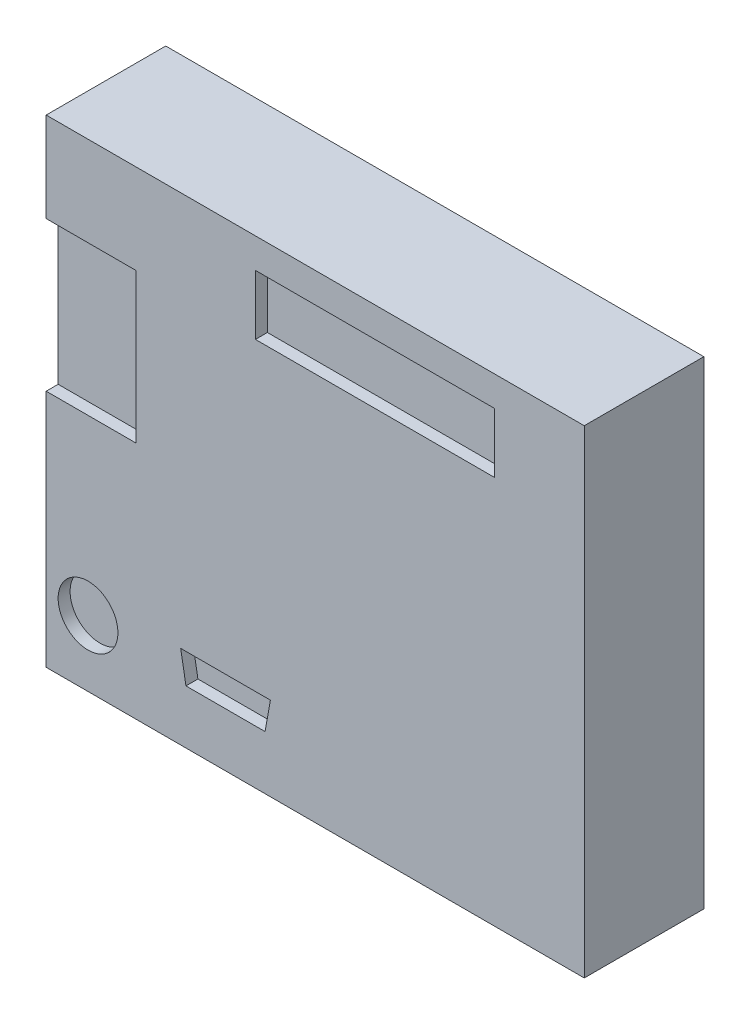
ISO-10303-21;
HEADER;
FILE_DESCRIPTION(('STEP AP214'),'2;1');
FILE_NAME('part.step','',(''),(''),'','','');
FILE_SCHEMA(('AUTOMOTIVE_DESIGN { 1 0 10303 214 1 1 1 1 }'));
ENDSEC;
DATA;
#1=APPLICATION_CONTEXT('core data for automotive mechanical design processes');
#2=APPLICATION_PROTOCOL_DEFINITION('international standard','automotive_design',2000,#1);
#3=PRODUCT_CONTEXT('',#1,'mechanical');
#4=PRODUCT('Part','Part','',(#3));
#5=PRODUCT_RELATED_PRODUCT_CATEGORY('part','',(#4));
#6=PRODUCT_DEFINITION_FORMATION('','',#4);
#7=PRODUCT_DEFINITION_CONTEXT('part definition',#1,'design');
#8=PRODUCT_DEFINITION('design','',#6,#7);
#9=PRODUCT_DEFINITION_SHAPE('','',#8);
#10=(LENGTH_UNIT() NAMED_UNIT(*) SI_UNIT(.MILLI.,.METRE.));
#11=(NAMED_UNIT(*) PLANE_ANGLE_UNIT() SI_UNIT($,.RADIAN.));
#12=(NAMED_UNIT(*) SI_UNIT($,.STERADIAN.) SOLID_ANGLE_UNIT());
#13=UNCERTAINTY_MEASURE_WITH_UNIT(LENGTH_MEASURE(1.E-05),#10,'distance_accuracy_value','');
#14=(GEOMETRIC_REPRESENTATION_CONTEXT(3) GLOBAL_UNCERTAINTY_ASSIGNED_CONTEXT((#13)) GLOBAL_UNIT_ASSIGNED_CONTEXT((#10,
#11,#12)) REPRESENTATION_CONTEXT('',''));
#15=CARTESIAN_POINT('',(0.,0.,0.));
#16=DIRECTION('',(0.,0.,1.));
#17=DIRECTION('',(1.,0.,0.));
#18=AXIS2_PLACEMENT_3D('',#15,#16,#17);
#19=CARTESIAN_POINT('',(45.,40.,20.));
#20=DIRECTION('',(-1.,0.,0.));
#21=DIRECTION('',(0.,-1.,0.));
#22=AXIS2_PLACEMENT_3D('',#19,#20,#21);
#23=PLANE('',#22);
#24=DIRECTION('',(0.,1.,0.));
#25=VECTOR('',#24,1.);
#26=CARTESIAN_POINT('',(45.,40.,0.));
#27=LINE('',#26,#25);
#28=CARTESIAN_POINT('',(45.,-40.,0.));
#29=VERTEX_POINT('',#28);
#30=CARTESIAN_POINT('',(45.,40.,0.));
#31=VERTEX_POINT('',#30);
#32=EDGE_CURVE('E271',#29,#31,#27,.T.);
#33=ORIENTED_EDGE('',*,*,#32,.T.);
#34=DIRECTION('',(0.,0.,-1.));
#35=VECTOR('',#34,1.);
#36=CARTESIAN_POINT('',(45.,40.,20.));
#37=LINE('',#36,#35);
#38=CARTESIAN_POINT('',(45.,40.,20.));
#39=VERTEX_POINT('',#38);
#40=EDGE_CURVE('E11',#39,#31,#37,.T.);
#41=ORIENTED_EDGE('',*,*,#40,.F.);
#42=DIRECTION('',(0.,1.,0.));
#43=VECTOR('',#42,1.);
#44=CARTESIAN_POINT('',(45.,40.,20.));
#45=LINE('',#44,#43);
#46=CARTESIAN_POINT('',(45.,-40.,20.));
#47=VERTEX_POINT('',#46);
#48=EDGE_CURVE('E281',#47,#39,#45,.T.);
#49=ORIENTED_EDGE('',*,*,#48,.F.);
#50=DIRECTION('',(0.,0.,-1.));
#51=VECTOR('',#50,1.);
#52=CARTESIAN_POINT('',(45.,-40.,20.));
#53=LINE('',#52,#51);
#54=EDGE_CURVE('E296',#47,#29,#53,.T.);
#55=ORIENTED_EDGE('',*,*,#54,.T.);
#56=EDGE_LOOP('',(#33,#41,#49,#55));
#57=FACE_BOUND('',#56,.T.);
#58=ADVANCED_FACE('F39',(#57),#23,.F.);
#59=CARTESIAN_POINT('',(-45.,40.,20.));
#60=DIRECTION('',(0.,-1.,0.));
#61=DIRECTION('',(0.,0.,-1.));
#62=AXIS2_PLACEMENT_3D('',#59,#60,#61);
#63=PLANE('',#62);
#64=DIRECTION('',(-1.,0.,0.));
#65=VECTOR('',#64,1.);
#66=CARTESIAN_POINT('',(-45.,40.,0.));
#67=LINE('',#66,#65);
#68=CARTESIAN_POINT('',(-45.,40.,0.));
#69=VERTEX_POINT('',#68);
#70=EDGE_CURVE('E300',#31,#69,#67,.T.);
#71=ORIENTED_EDGE('',*,*,#70,.T.);
#72=DIRECTION('',(0.,0.,-1.));
#73=VECTOR('',#72,1.);
#74=CARTESIAN_POINT('',(-45.,40.,20.));
#75=LINE('',#74,#73);
#76=CARTESIAN_POINT('',(-45.,40.,20.));
#77=VERTEX_POINT('',#76);
#78=EDGE_CURVE('E47',#77,#69,#75,.T.);
#79=ORIENTED_EDGE('',*,*,#78,.F.);
#80=DIRECTION('',(-1.,0.,0.));
#81=VECTOR('',#80,1.);
#82=CARTESIAN_POINT('',(-45.,40.,20.));
#83=LINE('',#82,#81);
#84=EDGE_CURVE('E285',#39,#77,#83,.T.);
#85=ORIENTED_EDGE('',*,*,#84,.F.);
#86=ORIENTED_EDGE('',*,*,#40,.T.);
#87=EDGE_LOOP('',(#71,#79,#85,#86));
#88=FACE_BOUND('',#87,.T.);
#89=ADVANCED_FACE('F365',(#88),#63,.F.);
#90=CARTESIAN_POINT('',(-45.,40.,20.));
#91=DIRECTION('',(1.,0.,0.));
#92=DIRECTION('',(0.,1.,0.));
#93=AXIS2_PLACEMENT_3D('',#90,#91,#92);
#94=PLANE('',#93);
#95=DIRECTION('',(0.,-1.,0.));
#96=VECTOR('',#95,1.);
#97=CARTESIAN_POINT('',(-45.,25.,18.));
#98=LINE('',#97,#96);
#99=CARTESIAN_POINT('',(-45.,25.,18.));
#100=VERTEX_POINT('',#99);
#101=CARTESIAN_POINT('',(-45.,0.,18.));
#102=VERTEX_POINT('',#101);
#103=EDGE_CURVE('E160',#100,#102,#98,.T.);
#104=ORIENTED_EDGE('',*,*,#103,.F.);
#105=DIRECTION('',(0.,0.,1.));
#106=VECTOR('',#105,1.);
#107=CARTESIAN_POINT('',(-45.,25.,18.));
#108=LINE('',#107,#106);
#109=CARTESIAN_POINT('',(-45.,25.,20.));
#110=VERTEX_POINT('',#109);
#111=EDGE_CURVE('E193',#100,#110,#108,.T.);
#112=ORIENTED_EDGE('',*,*,#111,.T.);
#113=DIRECTION('',(0.,-1.,0.));
#114=VECTOR('',#113,1.);
#115=CARTESIAN_POINT('',(-45.,40.,20.));
#116=LINE('',#115,#114);
#117=EDGE_CURVE('E289',#77,#110,#116,.T.);
#118=ORIENTED_EDGE('',*,*,#117,.F.);
#119=ORIENTED_EDGE('',*,*,#78,.T.);
#120=DIRECTION('',(0.,-1.,0.));
#121=VECTOR('',#120,1.);
#122=CARTESIAN_POINT('',(-45.,40.,0.));
#123=LINE('',#122,#121);
#124=CARTESIAN_POINT('',(-45.,-40.,0.));
#125=VERTEX_POINT('',#124);
#126=EDGE_CURVE('E303',#69,#125,#123,.T.);
#127=ORIENTED_EDGE('',*,*,#126,.T.);
#128=DIRECTION('',(0.,0.,-1.));
#129=VECTOR('',#128,1.);
#130=CARTESIAN_POINT('',(-45.,-40.,20.));
#131=LINE('',#130,#129);
#132=CARTESIAN_POINT('',(-45.,-40.,20.));
#133=VERTEX_POINT('',#132);
#134=EDGE_CURVE('E311',#133,#125,#131,.T.);
#135=ORIENTED_EDGE('',*,*,#134,.F.);
#136=CARTESIAN_POINT('',(-45.,0.,20.));
#137=VERTEX_POINT('',#136);
#138=EDGE_CURVE('E175',#137,#133,#116,.T.);
#139=ORIENTED_EDGE('',*,*,#138,.F.);
#140=DIRECTION('',(0.,0.,1.));
#141=VECTOR('',#140,1.);
#142=CARTESIAN_POINT('',(-45.,0.,18.));
#143=LINE('',#142,#141);
#144=EDGE_CURVE('E54',#102,#137,#143,.T.);
#145=ORIENTED_EDGE('',*,*,#144,.F.);
#146=EDGE_LOOP('',(#104,#112,#118,#119,#127,#135,#139,#145));
#147=FACE_BOUND('',#146,.T.);
#148=ADVANCED_FACE('F173',(#147),#94,.F.);
#149=CARTESIAN_POINT('',(-45.,-40.,20.));
#150=DIRECTION('',(0.,1.,0.));
#151=DIRECTION('',(0.,0.,1.));
#152=AXIS2_PLACEMENT_3D('',#149,#150,#151);
#153=PLANE('',#152);
#154=DIRECTION('',(1.,0.,0.));
#155=VECTOR('',#154,1.);
#156=CARTESIAN_POINT('',(-45.,-40.,0.));
#157=LINE('',#156,#155);
#158=EDGE_CURVE('E286',#125,#29,#157,.T.);
#159=ORIENTED_EDGE('',*,*,#158,.T.);
#160=ORIENTED_EDGE('',*,*,#54,.F.);
#161=DIRECTION('',(1.,0.,0.));
#162=VECTOR('',#161,1.);
#163=CARTESIAN_POINT('',(-45.,-40.,20.));
#164=LINE('',#163,#162);
#165=EDGE_CURVE('E293',#133,#47,#164,.T.);
#166=ORIENTED_EDGE('',*,*,#165,.F.);
#167=ORIENTED_EDGE('',*,*,#134,.T.);
#168=EDGE_LOOP('',(#159,#160,#166,#167));
#169=FACE_BOUND('',#168,.T.);
#170=ADVANCED_FACE('F326',(#169),#153,.F.);
#171=CARTESIAN_POINT('',(0.,0.,20.));
#172=DIRECTION('',(0.,0.,1.));
#173=DIRECTION('',(1.,0.,0.));
#174=AXIS2_PLACEMENT_3D('',#171,#172,#173);
#175=PLANE('',#174);
#176=DIRECTION('',(-1.,0.,0.));
#177=VECTOR('',#176,1.);
#178=CARTESIAN_POINT('',(-45.,25.,20.));
#179=LINE('',#178,#177);
#180=CARTESIAN_POINT('',(-30.,25.,20.));
#181=VERTEX_POINT('',#180);
#182=EDGE_CURVE('E170',#181,#110,#179,.T.);
#183=ORIENTED_EDGE('',*,*,#182,.F.);
#184=DIRECTION('',(0.,1.,0.));
#185=VECTOR('',#184,1.);
#186=CARTESIAN_POINT('',(-30.,25.,20.));
#187=LINE('',#186,#185);
#188=CARTESIAN_POINT('',(-30.,0.,20.));
#189=VERTEX_POINT('',#188);
#190=EDGE_CURVE('E346',#189,#181,#187,.T.);
#191=ORIENTED_EDGE('',*,*,#190,.F.);
#192=DIRECTION('',(1.,0.,0.));
#193=VECTOR('',#192,1.);
#194=CARTESIAN_POINT('',(-45.,0.,20.));
#195=LINE('',#194,#193);
#196=EDGE_CURVE('E336',#137,#189,#195,.T.);
#197=ORIENTED_EDGE('',*,*,#196,.F.);
#198=ORIENTED_EDGE('',*,*,#138,.T.);
#199=ORIENTED_EDGE('',*,*,#165,.T.);
#200=ORIENTED_EDGE('',*,*,#48,.T.);
#201=ORIENTED_EDGE('',*,*,#84,.T.);
#202=ORIENTED_EDGE('',*,*,#117,.T.);
#203=EDGE_LOOP('',(#183,#191,#197,#198,#199,#200,#201,#202));
#204=FACE_BOUND('',#203,.T.);
#205=CARTESIAN_POINT('',(-38.,-29.,20.));
#206=DIRECTION('',(0.,0.,1.));
#207=DIRECTION('',(1.,0.,0.));
#208=AXIS2_PLACEMENT_3D('',#205,#206,#207);
#209=CIRCLE('',#208,5.);
#210=CARTESIAN_POINT('',(-33.,-29.,20.));
#211=VERTEX_POINT('',#210);
#212=EDGE_CURVE('E189',#211,#211,#209,.T.);
#213=ORIENTED_EDGE('',*,*,#212,.F.);
#214=EDGE_LOOP('',(#213));
#215=FACE_BOUND('',#214,.T.);
#216=DIRECTION('',(0.173648177666934,0.984807753012207,0.));
#217=VECTOR('',#216,1.);
#218=CARTESIAN_POINT('',(-7.49999999999999,-26.,20.));
#219=LINE('',#218,#217);
#220=CARTESIAN_POINT('',(-8.38163490354234,-31.,20.));
#221=VERTEX_POINT('',#220);
#222=CARTESIAN_POINT('',(-7.49999999999999,-26.,20.));
#223=VERTEX_POINT('',#222);
#224=EDGE_CURVE('E62',#221,#223,#219,.T.);
#225=ORIENTED_EDGE('',*,*,#224,.F.);
#226=DIRECTION('',(1.,0.,0.));
#227=VECTOR('',#226,1.);
#228=CARTESIAN_POINT('',(-8.38163490354234,-31.,20.));
#229=LINE('',#228,#227);
#230=CARTESIAN_POINT('',(-21.6183650964576,-31.,20.));
#231=VERTEX_POINT('',#230);
#232=EDGE_CURVE('E199',#231,#221,#229,.T.);
#233=ORIENTED_EDGE('',*,*,#232,.F.);
#234=DIRECTION('',(0.173648177666935,-0.984807753012207,0.));
#235=VECTOR('',#234,1.);
#236=CARTESIAN_POINT('',(-21.6183650964576,-31.,20.));
#237=LINE('',#236,#235);
#238=CARTESIAN_POINT('',(-22.5,-26.,20.));
#239=VERTEX_POINT('',#238);
#240=EDGE_CURVE('E218',#239,#231,#237,.T.);
#241=ORIENTED_EDGE('',*,*,#240,.F.);
#242=DIRECTION('',(-1.,0.,0.));
#243=VECTOR('',#242,1.);
#244=CARTESIAN_POINT('',(-22.5,-26.,20.));
#245=LINE('',#244,#243);
#246=EDGE_CURVE('E214',#223,#239,#245,.T.);
#247=ORIENTED_EDGE('',*,*,#246,.F.);
#248=EDGE_LOOP('',(#225,#233,#241,#247));
#249=FACE_BOUND('',#248,.T.);
#250=DIRECTION('',(0.,-1.,0.));
#251=VECTOR('',#250,1.);
#252=CARTESIAN_POINT('',(-9.99999999999999,35.,20.));
#253=LINE('',#252,#251);
#254=CARTESIAN_POINT('',(-9.99999999999999,35.,20.));
#255=VERTEX_POINT('',#254);
#256=CARTESIAN_POINT('',(-9.99999999999999,25.,20.));
#257=VERTEX_POINT('',#256);
#258=EDGE_CURVE('E228',#255,#257,#253,.T.);
#259=ORIENTED_EDGE('',*,*,#258,.F.);
#260=DIRECTION('',(-1.,0.,0.));
#261=VECTOR('',#260,1.);
#262=CARTESIAN_POINT('',(-9.99999999999999,35.,20.));
#263=LINE('',#262,#261);
#264=CARTESIAN_POINT('',(30.,35.,20.));
#265=VERTEX_POINT('',#264);
#266=EDGE_CURVE('E242',#265,#255,#263,.T.);
#267=ORIENTED_EDGE('',*,*,#266,.F.);
#268=DIRECTION('',(0.,1.,0.));
#269=VECTOR('',#268,1.);
#270=CARTESIAN_POINT('',(30.,35.,20.));
#271=LINE('',#270,#269);
#272=CARTESIAN_POINT('',(30.,25.,20.));
#273=VERTEX_POINT('',#272);
#274=EDGE_CURVE('E261',#273,#265,#271,.T.);
#275=ORIENTED_EDGE('',*,*,#274,.F.);
#276=DIRECTION('',(1.,0.,0.));
#277=VECTOR('',#276,1.);
#278=CARTESIAN_POINT('',(-9.99999999999999,25.,20.));
#279=LINE('',#278,#277);
#280=EDGE_CURVE('E257',#257,#273,#279,.T.);
#281=ORIENTED_EDGE('',*,*,#280,.F.);
#282=EDGE_LOOP('',(#259,#267,#275,#281));
#283=FACE_BOUND('',#282,.T.);
#284=ADVANCED_FACE('F333',(#204,#215,#249,#283),#175,.T.);
#285=CARTESIAN_POINT('',(0.,0.,0.));
#286=DIRECTION('',(0.,0.,1.));
#287=DIRECTION('',(1.,0.,0.));
#288=AXIS2_PLACEMENT_3D('',#285,#286,#287);
#289=PLANE('',#288);
#290=ORIENTED_EDGE('',*,*,#32,.F.);
#291=ORIENTED_EDGE('',*,*,#158,.F.);
#292=ORIENTED_EDGE('',*,*,#126,.F.);
#293=ORIENTED_EDGE('',*,*,#70,.F.);
#294=EDGE_LOOP('',(#290,#291,#292,#293));
#295=FACE_BOUND('',#294,.T.);
#296=ADVANCED_FACE('F323',(#295),#289,.F.);
#297=CARTESIAN_POINT('',(-9.99999999999999,35.,18.));
#298=DIRECTION('',(-1.,0.,0.));
#299=DIRECTION('',(0.,0.,1.));
#300=AXIS2_PLACEMENT_3D('',#297,#298,#299);
#301=PLANE('',#300);
#302=ORIENTED_EDGE('',*,*,#258,.T.);
#303=DIRECTION('',(0.,0.,1.));
#304=VECTOR('',#303,1.);
#305=CARTESIAN_POINT('',(-9.99999999999999,25.,18.));
#306=LINE('',#305,#304);
#307=CARTESIAN_POINT('',(-9.99999999999999,25.,18.));
#308=VERTEX_POINT('',#307);
#309=EDGE_CURVE('E254',#308,#257,#306,.T.);
#310=ORIENTED_EDGE('',*,*,#309,.F.);
#311=DIRECTION('',(0.,-1.,0.));
#312=VECTOR('',#311,1.);
#313=CARTESIAN_POINT('',(-9.99999999999999,35.,18.));
#314=LINE('',#313,#312);
#315=CARTESIAN_POINT('',(-9.99999999999999,35.,18.));
#316=VERTEX_POINT('',#315);
#317=EDGE_CURVE('E237',#316,#308,#314,.T.);
#318=ORIENTED_EDGE('',*,*,#317,.F.);
#319=DIRECTION('',(0.,0.,1.));
#320=VECTOR('',#319,1.);
#321=CARTESIAN_POINT('',(-9.99999999999999,35.,18.));
#322=LINE('',#321,#320);
#323=EDGE_CURVE('E268',#316,#255,#322,.T.);
#324=ORIENTED_EDGE('',*,*,#323,.T.);
#325=EDGE_LOOP('',(#302,#310,#318,#324));
#326=FACE_BOUND('',#325,.T.);
#327=ADVANCED_FACE('F378',(#326),#301,.F.);
#328=CARTESIAN_POINT('',(-9.99999999999999,35.,18.));
#329=DIRECTION('',(0.,1.,0.));
#330=DIRECTION('',(-1.,0.,0.));
#331=AXIS2_PLACEMENT_3D('',#328,#329,#330);
#332=PLANE('',#331);
#333=ORIENTED_EDGE('',*,*,#266,.T.);
#334=ORIENTED_EDGE('',*,*,#323,.F.);
#335=DIRECTION('',(-1.,0.,0.));
#336=VECTOR('',#335,1.);
#337=CARTESIAN_POINT('',(-9.99999999999999,35.,18.));
#338=LINE('',#337,#336);
#339=CARTESIAN_POINT('',(30.,35.,18.));
#340=VERTEX_POINT('',#339);
#341=EDGE_CURVE('E250',#340,#316,#338,.T.);
#342=ORIENTED_EDGE('',*,*,#341,.F.);
#343=DIRECTION('',(0.,0.,1.));
#344=VECTOR('',#343,1.);
#345=CARTESIAN_POINT('',(30.,35.,18.));
#346=LINE('',#345,#344);
#347=EDGE_CURVE('E272',#340,#265,#346,.T.);
#348=ORIENTED_EDGE('',*,*,#347,.T.);
#349=EDGE_LOOP('',(#333,#334,#342,#348));
#350=FACE_BOUND('',#349,.T.);
#351=ADVANCED_FACE('F383',(#350),#332,.F.);
#352=CARTESIAN_POINT('',(30.,35.,18.));
#353=DIRECTION('',(1.,0.,0.));
#354=DIRECTION('',(0.,0.,-1.));
#355=AXIS2_PLACEMENT_3D('',#352,#353,#354);
#356=PLANE('',#355);
#357=ORIENTED_EDGE('',*,*,#274,.T.);
#358=ORIENTED_EDGE('',*,*,#347,.F.);
#359=DIRECTION('',(0.,1.,0.));
#360=VECTOR('',#359,1.);
#361=CARTESIAN_POINT('',(30.,35.,18.));
#362=LINE('',#361,#360);
#363=CARTESIAN_POINT('',(30.,25.,18.));
#364=VERTEX_POINT('',#363);
#365=EDGE_CURVE('E246',#364,#340,#362,.T.);
#366=ORIENTED_EDGE('',*,*,#365,.F.);
#367=DIRECTION('',(0.,0.,1.));
#368=VECTOR('',#367,1.);
#369=CARTESIAN_POINT('',(30.,25.,18.));
#370=LINE('',#369,#368);
#371=EDGE_CURVE('E275',#364,#273,#370,.T.);
#372=ORIENTED_EDGE('',*,*,#371,.T.);
#373=EDGE_LOOP('',(#357,#358,#366,#372));
#374=FACE_BOUND('',#373,.T.);
#375=ADVANCED_FACE('F389',(#374),#356,.F.);
#376=CARTESIAN_POINT('',(-9.99999999999999,25.,18.));
#377=DIRECTION('',(0.,-1.,0.));
#378=DIRECTION('',(1.,0.,0.));
#379=AXIS2_PLACEMENT_3D('',#376,#377,#378);
#380=PLANE('',#379);
#381=ORIENTED_EDGE('',*,*,#280,.T.);
#382=ORIENTED_EDGE('',*,*,#371,.F.);
#383=DIRECTION('',(1.,0.,0.));
#384=VECTOR('',#383,1.);
#385=CARTESIAN_POINT('',(-9.99999999999999,25.,18.));
#386=LINE('',#385,#384);
#387=EDGE_CURVE('E241',#308,#364,#386,.T.);
#388=ORIENTED_EDGE('',*,*,#387,.F.);
#389=ORIENTED_EDGE('',*,*,#309,.T.);
#390=EDGE_LOOP('',(#381,#382,#388,#389));
#391=FACE_BOUND('',#390,.T.);
#392=ADVANCED_FACE('F385',(#391),#380,.F.);
#393=CARTESIAN_POINT('',(0.,0.,18.));
#394=DIRECTION('',(0.,0.,1.));
#395=DIRECTION('',(1.,0.,0.));
#396=AXIS2_PLACEMENT_3D('',#393,#394,#395);
#397=PLANE('',#396);
#398=ORIENTED_EDGE('',*,*,#317,.T.);
#399=ORIENTED_EDGE('',*,*,#387,.T.);
#400=ORIENTED_EDGE('',*,*,#365,.T.);
#401=ORIENTED_EDGE('',*,*,#341,.T.);
#402=EDGE_LOOP('',(#398,#399,#400,#401));
#403=FACE_BOUND('',#402,.T.);
#404=ADVANCED_FACE('F388',(#403),#397,.T.);
#405=CARTESIAN_POINT('',(-7.49999999999999,-26.,18.));
#406=DIRECTION('',(0.984807753012207,-0.173648177666934,0.));
#407=DIRECTION('',(0.173648177666934,0.984807753012208,0.));
#408=AXIS2_PLACEMENT_3D('',#405,#406,#407);
#409=PLANE('',#408);
#410=ORIENTED_EDGE('',*,*,#224,.T.);
#411=DIRECTION('',(0.,0.,1.));
#412=VECTOR('',#411,1.);
#413=CARTESIAN_POINT('',(-7.49999999999999,-26.,18.));
#414=LINE('',#413,#412);
#415=CARTESIAN_POINT('',(-7.49999999999999,-26.,18.));
#416=VERTEX_POINT('',#415);
#417=EDGE_CURVE('E211',#416,#223,#414,.T.);
#418=ORIENTED_EDGE('',*,*,#417,.F.);
#419=DIRECTION('',(0.173648177666934,0.984807753012207,0.));
#420=VECTOR('',#419,1.);
#421=CARTESIAN_POINT('',(-7.49999999999999,-26.,18.));
#422=LINE('',#421,#420);
#423=CARTESIAN_POINT('',(-8.38163490354234,-31.,18.));
#424=VERTEX_POINT('',#423);
#425=EDGE_CURVE('E194',#424,#416,#422,.T.);
#426=ORIENTED_EDGE('',*,*,#425,.F.);
#427=DIRECTION('',(0.,0.,1.));
#428=VECTOR('',#427,1.);
#429=CARTESIAN_POINT('',(-8.38163490354234,-31.,18.));
#430=LINE('',#429,#428);
#431=EDGE_CURVE('E225',#424,#221,#430,.T.);
#432=ORIENTED_EDGE('',*,*,#431,.T.);
#433=EDGE_LOOP('',(#410,#418,#426,#432));
#434=FACE_BOUND('',#433,.T.);
#435=ADVANCED_FACE('F399',(#434),#409,.F.);
#436=CARTESIAN_POINT('',(-8.38163490354234,-31.,18.));
#437=DIRECTION('',(0.,-1.,0.));
#438=DIRECTION('',(0.,0.,-1.));
#439=AXIS2_PLACEMENT_3D('',#436,#437,#438);
#440=PLANE('',#439);
#441=ORIENTED_EDGE('',*,*,#232,.T.);
#442=ORIENTED_EDGE('',*,*,#431,.F.);
#443=DIRECTION('',(1.,0.,0.));
#444=VECTOR('',#443,1.);
#445=CARTESIAN_POINT('',(-8.38163490354234,-31.,18.));
#446=LINE('',#445,#444);
#447=CARTESIAN_POINT('',(-21.6183650964576,-31.,18.));
#448=VERTEX_POINT('',#447);
#449=EDGE_CURVE('E207',#448,#424,#446,.T.);
#450=ORIENTED_EDGE('',*,*,#449,.F.);
#451=DIRECTION('',(0.,0.,1.));
#452=VECTOR('',#451,1.);
#453=CARTESIAN_POINT('',(-21.6183650964576,-31.,18.));
#454=LINE('',#453,#452);
#455=EDGE_CURVE('E229',#448,#231,#454,.T.);
#456=ORIENTED_EDGE('',*,*,#455,.T.);
#457=EDGE_LOOP('',(#441,#442,#450,#456));
#458=FACE_BOUND('',#457,.T.);
#459=ADVANCED_FACE('F403',(#458),#440,.F.);
#460=CARTESIAN_POINT('',(-21.6183650964576,-31.,18.));
#461=DIRECTION('',(-0.984807753012207,-0.173648177666935,0.));
#462=DIRECTION('',(0.173648177666935,-0.984807753012207,0.));
#463=AXIS2_PLACEMENT_3D('',#460,#461,#462);
#464=PLANE('',#463);
#465=ORIENTED_EDGE('',*,*,#240,.T.);
#466=ORIENTED_EDGE('',*,*,#455,.F.);
#467=DIRECTION('',(0.173648177666935,-0.984807753012207,0.));
#468=VECTOR('',#467,1.);
#469=CARTESIAN_POINT('',(-21.6183650964576,-31.,18.));
#470=LINE('',#469,#468);
#471=CARTESIAN_POINT('',(-22.5,-26.,18.));
#472=VERTEX_POINT('',#471);
#473=EDGE_CURVE('E203',#472,#448,#470,.T.);
#474=ORIENTED_EDGE('',*,*,#473,.F.);
#475=DIRECTION('',(0.,0.,1.));
#476=VECTOR('',#475,1.);
#477=CARTESIAN_POINT('',(-22.5,-26.,18.));
#478=LINE('',#477,#476);
#479=EDGE_CURVE('E232',#472,#239,#478,.T.);
#480=ORIENTED_EDGE('',*,*,#479,.T.);
#481=EDGE_LOOP('',(#465,#466,#474,#480));
#482=FACE_BOUND('',#481,.T.);
#483=ADVANCED_FACE('F408',(#482),#464,.F.);
#484=CARTESIAN_POINT('',(-22.5,-26.,18.));
#485=DIRECTION('',(0.,1.,0.));
#486=DIRECTION('',(-1.,0.,0.));
#487=AXIS2_PLACEMENT_3D('',#484,#485,#486);
#488=PLANE('',#487);
#489=ORIENTED_EDGE('',*,*,#246,.T.);
#490=ORIENTED_EDGE('',*,*,#479,.F.);
#491=DIRECTION('',(-1.,0.,0.));
#492=VECTOR('',#491,1.);
#493=CARTESIAN_POINT('',(-22.5,-26.,18.));
#494=LINE('',#493,#492);
#495=EDGE_CURVE('E198',#416,#472,#494,.T.);
#496=ORIENTED_EDGE('',*,*,#495,.F.);
#497=ORIENTED_EDGE('',*,*,#417,.T.);
#498=EDGE_LOOP('',(#489,#490,#496,#497));
#499=FACE_BOUND('',#498,.T.);
#500=ADVANCED_FACE('F404',(#499),#488,.F.);
#501=CARTESIAN_POINT('',(0.,0.,18.));
#502=DIRECTION('',(0.,0.,-1.));
#503=DIRECTION('',(-1.,0.,0.));
#504=AXIS2_PLACEMENT_3D('',#501,#502,#503);
#505=PLANE('',#504);
#506=ORIENTED_EDGE('',*,*,#425,.T.);
#507=ORIENTED_EDGE('',*,*,#495,.T.);
#508=ORIENTED_EDGE('',*,*,#473,.T.);
#509=ORIENTED_EDGE('',*,*,#449,.T.);
#510=EDGE_LOOP('',(#506,#507,#508,#509));
#511=FACE_BOUND('',#510,.T.);
#512=ADVANCED_FACE('F407',(#511),#505,.F.);
#513=CARTESIAN_POINT('',(-38.,-29.,18.));
#514=DIRECTION('',(0.,0.,1.));
#515=DIRECTION('',(1.,0.,0.));
#516=AXIS2_PLACEMENT_3D('',#513,#514,#515);
#517=CYLINDRICAL_SURFACE('',#516,5.);
#518=CARTESIAN_POINT('',(-38.,-29.,18.));
#519=DIRECTION('',(0.,0.,1.));
#520=DIRECTION('',(1.,0.,0.));
#521=AXIS2_PLACEMENT_3D('',#518,#519,#520);
#522=CIRCLE('',#521,5.);
#523=CARTESIAN_POINT('',(-33.,-29.,18.));
#524=VERTEX_POINT('',#523);
#525=EDGE_CURVE('E185',#524,#524,#522,.T.);
#526=ORIENTED_EDGE('',*,*,#525,.F.);
#527=EDGE_LOOP('',(#526));
#528=FACE_BOUND('',#527,.T.);
#529=ORIENTED_EDGE('',*,*,#212,.T.);
#530=EDGE_LOOP('',(#529));
#531=FACE_BOUND('',#530,.T.);
#532=ADVANCED_FACE('F418',(#528,#531),#517,.F.);
#533=CARTESIAN_POINT('',(-38.,-29.,18.));
#534=DIRECTION('',(0.,0.,1.));
#535=DIRECTION('',(1.,0.,0.));
#536=AXIS2_PLACEMENT_3D('',#533,#534,#535);
#537=PLANE('',#536);
#538=ORIENTED_EDGE('',*,*,#525,.T.);
#539=EDGE_LOOP('',(#538));
#540=FACE_BOUND('',#539,.T.);
#541=ADVANCED_FACE('F362',(#540),#537,.T.);
#542=CARTESIAN_POINT('',(-45.,25.,18.));
#543=DIRECTION('',(0.,1.,0.));
#544=DIRECTION('',(0.,0.,1.));
#545=AXIS2_PLACEMENT_3D('',#542,#543,#544);
#546=PLANE('',#545);
#547=ORIENTED_EDGE('',*,*,#182,.T.);
#548=ORIENTED_EDGE('',*,*,#111,.F.);
#549=DIRECTION('',(-1.,0.,0.));
#550=VECTOR('',#549,1.);
#551=CARTESIAN_POINT('',(-45.,25.,18.));
#552=LINE('',#551,#550);
#553=CARTESIAN_POINT('',(-30.,25.,18.));
#554=VERTEX_POINT('',#553);
#555=EDGE_CURVE('E166',#554,#100,#552,.T.);
#556=ORIENTED_EDGE('',*,*,#555,.F.);
#557=DIRECTION('',(0.,0.,1.));
#558=VECTOR('',#557,1.);
#559=CARTESIAN_POINT('',(-30.,25.,18.));
#560=LINE('',#559,#558);
#561=EDGE_CURVE('E180',#554,#181,#560,.T.);
#562=ORIENTED_EDGE('',*,*,#561,.T.);
#563=EDGE_LOOP('',(#547,#548,#556,#562));
#564=FACE_BOUND('',#563,.T.);
#565=ADVANCED_FACE('F353',(#564),#546,.F.);
#566=CARTESIAN_POINT('',(-30.,25.,18.));
#567=DIRECTION('',(1.,0.,0.));
#568=DIRECTION('',(0.,1.,0.));
#569=AXIS2_PLACEMENT_3D('',#566,#567,#568);
#570=PLANE('',#569);
#571=ORIENTED_EDGE('',*,*,#190,.T.);
#572=ORIENTED_EDGE('',*,*,#561,.F.);
#573=DIRECTION('',(0.,1.,0.));
#574=VECTOR('',#573,1.);
#575=CARTESIAN_POINT('',(-30.,25.,18.));
#576=LINE('',#575,#574);
#577=CARTESIAN_POINT('',(-30.,0.,18.));
#578=VERTEX_POINT('',#577);
#579=EDGE_CURVE('E159',#578,#554,#576,.T.);
#580=ORIENTED_EDGE('',*,*,#579,.F.);
#581=DIRECTION('',(0.,0.,1.));
#582=VECTOR('',#581,1.);
#583=CARTESIAN_POINT('',(-30.,0.,18.));
#584=LINE('',#583,#582);
#585=EDGE_CURVE('E154',#578,#189,#584,.T.);
#586=ORIENTED_EDGE('',*,*,#585,.T.);
#587=EDGE_LOOP('',(#571,#572,#580,#586));
#588=FACE_BOUND('',#587,.T.);
#589=ADVANCED_FACE('F354',(#588),#570,.F.);
#590=CARTESIAN_POINT('',(-45.,0.,18.));
#591=DIRECTION('',(0.,-1.,0.));
#592=DIRECTION('',(0.,0.,-1.));
#593=AXIS2_PLACEMENT_3D('',#590,#591,#592);
#594=PLANE('',#593);
#595=ORIENTED_EDGE('',*,*,#196,.T.);
#596=ORIENTED_EDGE('',*,*,#585,.F.);
#597=DIRECTION('',(1.,0.,0.));
#598=VECTOR('',#597,1.);
#599=CARTESIAN_POINT('',(-45.,0.,18.));
#600=LINE('',#599,#598);
#601=EDGE_CURVE('E151',#102,#578,#600,.T.);
#602=ORIENTED_EDGE('',*,*,#601,.F.);
#603=ORIENTED_EDGE('',*,*,#144,.T.);
#604=EDGE_LOOP('',(#595,#596,#602,#603));
#605=FACE_BOUND('',#604,.T.);
#606=ADVANCED_FACE('F153',(#605),#594,.F.);
#607=CARTESIAN_POINT('',(0.,0.,18.));
#608=DIRECTION('',(0.,0.,1.));
#609=DIRECTION('',(1.,0.,0.));
#610=AXIS2_PLACEMENT_3D('',#607,#608,#609);
#611=PLANE('',#610);
#612=ORIENTED_EDGE('',*,*,#103,.T.);
#613=ORIENTED_EDGE('',*,*,#601,.T.);
#614=ORIENTED_EDGE('',*,*,#579,.T.);
#615=ORIENTED_EDGE('',*,*,#555,.T.);
#616=EDGE_LOOP('',(#612,#613,#614,#615));
#617=FACE_BOUND('',#616,.T.);
#618=ADVANCED_FACE('F164',(#617),#611,.T.);
#619=CLOSED_SHELL('',(#58,#89,#148,#170,#284,#296,#327,#351,#375,#392,#404,#435,#459,#483,#500,
#512,#532,#541,#565,#589,#606,#618));
#620=MANIFOLD_SOLID_BREP('B2',#619);
#621=ADVANCED_BREP_SHAPE_REPRESENTATION('',(#18,#620),#14);
#622=SHAPE_DEFINITION_REPRESENTATION(#9,#621);
ENDSEC;
END-ISO-10303-21;
